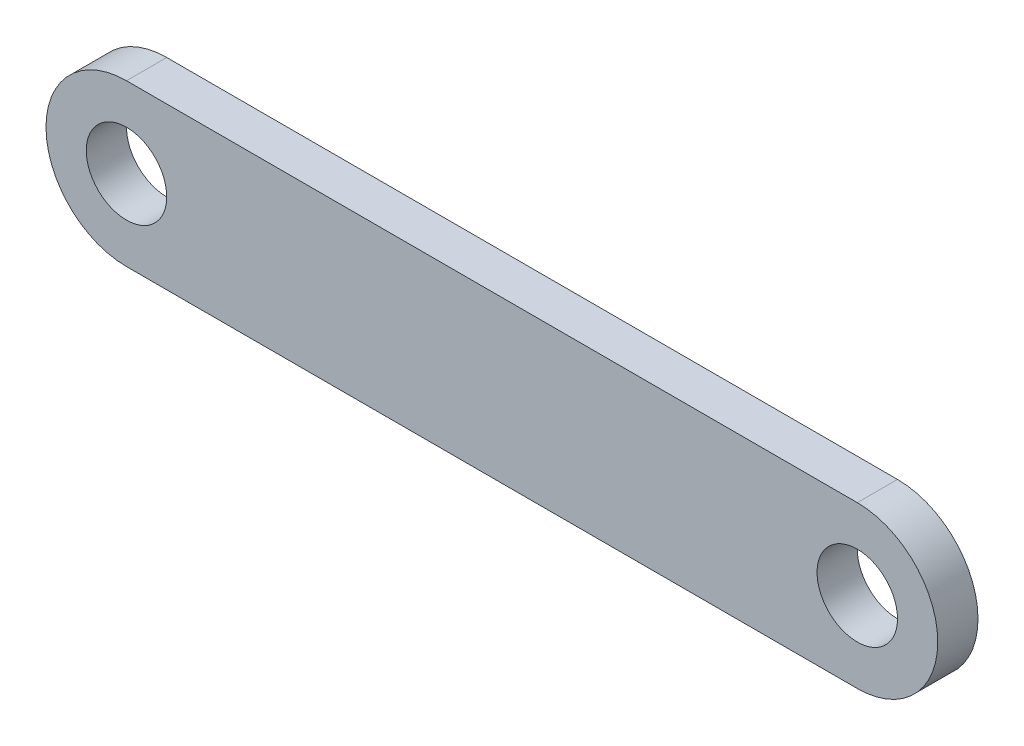
ISO-10303-21;
HEADER;
FILE_DESCRIPTION(('STEP AP214'),'2;1');
FILE_NAME('part.step','',(''),(''),'','','');
FILE_SCHEMA(('AUTOMOTIVE_DESIGN { 1 0 10303 214 1 1 1 1 }'));
ENDSEC;
DATA;
#1=APPLICATION_CONTEXT('core data for automotive mechanical design processes');
#2=APPLICATION_PROTOCOL_DEFINITION('international standard','automotive_design',2000,#1);
#3=PRODUCT_CONTEXT('',#1,'mechanical');
#4=PRODUCT('Part','Part','',(#3));
#5=PRODUCT_RELATED_PRODUCT_CATEGORY('part','',(#4));
#6=PRODUCT_DEFINITION_FORMATION('','',#4);
#7=PRODUCT_DEFINITION_CONTEXT('part definition',#1,'design');
#8=PRODUCT_DEFINITION('design','',#6,#7);
#9=PRODUCT_DEFINITION_SHAPE('','',#8);
#10=(LENGTH_UNIT() NAMED_UNIT(*) SI_UNIT(.MILLI.,.METRE.));
#11=(NAMED_UNIT(*) PLANE_ANGLE_UNIT() SI_UNIT($,.RADIAN.));
#12=(NAMED_UNIT(*) SI_UNIT($,.STERADIAN.) SOLID_ANGLE_UNIT());
#13=UNCERTAINTY_MEASURE_WITH_UNIT(LENGTH_MEASURE(1.E-05),#10,'distance_accuracy_value','');
#14=(GEOMETRIC_REPRESENTATION_CONTEXT(3) GLOBAL_UNCERTAINTY_ASSIGNED_CONTEXT((#13)) GLOBAL_UNIT_ASSIGNED_CONTEXT((#10,
#11,#12)) REPRESENTATION_CONTEXT('',''));
#15=CARTESIAN_POINT('',(0.,0.,0.));
#16=DIRECTION('',(0.,0.,1.));
#17=DIRECTION('',(1.,0.,0.));
#18=AXIS2_PLACEMENT_3D('',#15,#16,#17);
#19=CARTESIAN_POINT('',(0.,-2.,-1.));
#20=DIRECTION('',(0.,-1.,0.));
#21=DIRECTION('',(1.,0.,0.));
#22=AXIS2_PLACEMENT_3D('',#19,#20,#21);
#23=PLANE('',#22);
#24=DIRECTION('',(1.,0.,0.));
#25=VECTOR('',#24,1.);
#26=CARTESIAN_POINT('',(0.,-2.,0.));
#27=LINE('',#26,#25);
#28=CARTESIAN_POINT('',(0.,-2.,0.));
#29=VERTEX_POINT('',#28);
#30=CARTESIAN_POINT('',(18.16,-2.,0.));
#31=VERTEX_POINT('',#30);
#32=EDGE_CURVE('E110',#29,#31,#27,.T.);
#33=ORIENTED_EDGE('',*,*,#32,.F.);
#34=DIRECTION('',(0.,0.,1.));
#35=VECTOR('',#34,1.);
#36=CARTESIAN_POINT('',(0.,-2.,-1.));
#37=LINE('',#36,#35);
#38=CARTESIAN_POINT('',(0.,-2.,-1.));
#39=VERTEX_POINT('',#38);
#40=EDGE_CURVE('E11',#39,#29,#37,.T.);
#41=ORIENTED_EDGE('',*,*,#40,.F.);
#42=DIRECTION('',(1.,0.,0.));
#43=VECTOR('',#42,1.);
#44=CARTESIAN_POINT('',(0.,-2.,-1.));
#45=LINE('',#44,#43);
#46=CARTESIAN_POINT('',(18.16,-2.,-1.));
#47=VERTEX_POINT('',#46);
#48=EDGE_CURVE('E98',#39,#47,#45,.T.);
#49=ORIENTED_EDGE('',*,*,#48,.T.);
#50=DIRECTION('',(0.,0.,1.));
#51=VECTOR('',#50,1.);
#52=CARTESIAN_POINT('',(18.16,-2.,-1.));
#53=LINE('',#52,#51);
#54=EDGE_CURVE('E42',#47,#31,#53,.T.);
#55=ORIENTED_EDGE('',*,*,#54,.T.);
#56=EDGE_LOOP('',(#33,#41,#49,#55));
#57=FACE_BOUND('',#56,.T.);
#58=ADVANCED_FACE('F39',(#57),#23,.T.);
#59=CARTESIAN_POINT('',(0.,0.,-1.));
#60=DIRECTION('',(0.,0.,1.));
#61=DIRECTION('',(1.,0.,0.));
#62=AXIS2_PLACEMENT_3D('',#59,#60,#61);
#63=CYLINDRICAL_SURFACE('',#62,2.);
#64=CARTESIAN_POINT('',(0.,0.,0.));
#65=DIRECTION('',(0.,0.,1.));
#66=DIRECTION('',(1.,0.,0.));
#67=AXIS2_PLACEMENT_3D('',#64,#65,#66);
#68=CIRCLE('',#67,2.);
#69=CARTESIAN_POINT('',(0.,2.,0.));
#70=VERTEX_POINT('',#69);
#71=EDGE_CURVE('E116',#70,#29,#68,.T.);
#72=ORIENTED_EDGE('',*,*,#71,.F.);
#73=DIRECTION('',(0.,0.,1.));
#74=VECTOR('',#73,1.);
#75=CARTESIAN_POINT('',(0.,2.,-1.));
#76=LINE('',#75,#74);
#77=CARTESIAN_POINT('',(0.,2.,-1.));
#78=VERTEX_POINT('',#77);
#79=EDGE_CURVE('E48',#78,#70,#76,.T.);
#80=ORIENTED_EDGE('',*,*,#79,.F.);
#81=CARTESIAN_POINT('',(0.,0.,-1.));
#82=DIRECTION('',(0.,0.,1.));
#83=DIRECTION('',(1.,0.,0.));
#84=AXIS2_PLACEMENT_3D('',#81,#82,#83);
#85=CIRCLE('',#84,2.);
#86=EDGE_CURVE('E91',#78,#39,#85,.T.);
#87=ORIENTED_EDGE('',*,*,#86,.T.);
#88=ORIENTED_EDGE('',*,*,#40,.T.);
#89=EDGE_LOOP('',(#72,#80,#87,#88));
#90=FACE_BOUND('',#89,.T.);
#91=ADVANCED_FACE('F139',(#90),#63,.T.);
#92=CARTESIAN_POINT('',(0.,2.,-1.));
#93=DIRECTION('',(0.,-1.,0.));
#94=DIRECTION('',(1.,0.,0.));
#95=AXIS2_PLACEMENT_3D('',#92,#93,#94);
#96=PLANE('',#95);
#97=DIRECTION('',(1.,0.,0.));
#98=VECTOR('',#97,1.);
#99=CARTESIAN_POINT('',(0.,2.,0.));
#100=LINE('',#99,#98);
#101=CARTESIAN_POINT('',(18.16,2.,0.));
#102=VERTEX_POINT('',#101);
#103=EDGE_CURVE('E95',#70,#102,#100,.T.);
#104=ORIENTED_EDGE('',*,*,#103,.T.);
#105=DIRECTION('',(0.,0.,1.));
#106=VECTOR('',#105,1.);
#107=CARTESIAN_POINT('',(18.16,2.,-1.));
#108=LINE('',#107,#106);
#109=CARTESIAN_POINT('',(18.16,2.,-1.));
#110=VERTEX_POINT('',#109);
#111=EDGE_CURVE('E93',#110,#102,#108,.T.);
#112=ORIENTED_EDGE('',*,*,#111,.F.);
#113=DIRECTION('',(1.,0.,0.));
#114=VECTOR('',#113,1.);
#115=CARTESIAN_POINT('',(0.,2.,-1.));
#116=LINE('',#115,#114);
#117=EDGE_CURVE('E86',#78,#110,#116,.T.);
#118=ORIENTED_EDGE('',*,*,#117,.F.);
#119=ORIENTED_EDGE('',*,*,#79,.T.);
#120=EDGE_LOOP('',(#104,#112,#118,#119));
#121=FACE_BOUND('',#120,.T.);
#122=ADVANCED_FACE('F94',(#121),#96,.F.);
#123=CARTESIAN_POINT('',(0.,0.,-1.));
#124=DIRECTION('',(0.,0.,1.));
#125=DIRECTION('',(1.,0.,0.));
#126=AXIS2_PLACEMENT_3D('',#123,#124,#125);
#127=CYLINDRICAL_SURFACE('',#126,1.);
#128=CARTESIAN_POINT('',(0.,0.,-1.));
#129=DIRECTION('',(0.,0.,1.));
#130=DIRECTION('',(1.,0.,0.));
#131=AXIS2_PLACEMENT_3D('',#128,#129,#130);
#132=CIRCLE('',#131,1.);
#133=CARTESIAN_POINT('',(1.,0.,-1.));
#134=VERTEX_POINT('',#133);
#135=EDGE_CURVE('E104',#134,#134,#132,.T.);
#136=ORIENTED_EDGE('',*,*,#135,.F.);
#137=EDGE_LOOP('',(#136));
#138=FACE_BOUND('',#137,.T.);
#139=CARTESIAN_POINT('',(0.,0.,0.));
#140=DIRECTION('',(0.,0.,1.));
#141=DIRECTION('',(1.,0.,0.));
#142=AXIS2_PLACEMENT_3D('',#139,#140,#141);
#143=CIRCLE('',#142,1.);
#144=CARTESIAN_POINT('',(1.,0.,0.));
#145=VERTEX_POINT('',#144);
#146=EDGE_CURVE('E119',#145,#145,#143,.T.);
#147=ORIENTED_EDGE('',*,*,#146,.T.);
#148=EDGE_LOOP('',(#147));
#149=FACE_BOUND('',#148,.T.);
#150=ADVANCED_FACE('F147',(#138,#149),#127,.F.);
#151=CARTESIAN_POINT('',(18.16,0.,-1.));
#152=DIRECTION('',(0.,0.,1.));
#153=DIRECTION('',(1.,0.,0.));
#154=AXIS2_PLACEMENT_3D('',#151,#152,#153);
#155=CYLINDRICAL_SURFACE('',#154,2.);
#156=CARTESIAN_POINT('',(18.16,0.,0.));
#157=DIRECTION('',(0.,0.,1.));
#158=DIRECTION('',(1.,0.,0.));
#159=AXIS2_PLACEMENT_3D('',#156,#157,#158);
#160=CIRCLE('',#159,2.);
#161=EDGE_CURVE('E113',#31,#102,#160,.T.);
#162=ORIENTED_EDGE('',*,*,#161,.F.);
#163=ORIENTED_EDGE('',*,*,#54,.F.);
#164=CARTESIAN_POINT('',(18.16,0.,-1.));
#165=DIRECTION('',(0.,0.,1.));
#166=DIRECTION('',(1.,0.,0.));
#167=AXIS2_PLACEMENT_3D('',#164,#165,#166);
#168=CIRCLE('',#167,2.);
#169=EDGE_CURVE('E90',#47,#110,#168,.T.);
#170=ORIENTED_EDGE('',*,*,#169,.T.);
#171=ORIENTED_EDGE('',*,*,#111,.T.);
#172=EDGE_LOOP('',(#162,#163,#170,#171));
#173=FACE_BOUND('',#172,.T.);
#174=ADVANCED_FACE('F97',(#173),#155,.T.);
#175=CARTESIAN_POINT('',(18.16,0.,-1.));
#176=DIRECTION('',(0.,0.,1.));
#177=DIRECTION('',(1.,0.,0.));
#178=AXIS2_PLACEMENT_3D('',#175,#176,#177);
#179=CYLINDRICAL_SURFACE('',#178,1.);
#180=CARTESIAN_POINT('',(18.16,0.,-1.));
#181=DIRECTION('',(0.,0.,1.));
#182=DIRECTION('',(1.,0.,0.));
#183=AXIS2_PLACEMENT_3D('',#180,#181,#182);
#184=CIRCLE('',#183,1.);
#185=CARTESIAN_POINT('',(19.16,0.,-1.));
#186=VERTEX_POINT('',#185);
#187=EDGE_CURVE('E107',#186,#186,#184,.T.);
#188=ORIENTED_EDGE('',*,*,#187,.F.);
#189=EDGE_LOOP('',(#188));
#190=FACE_BOUND('',#189,.T.);
#191=CARTESIAN_POINT('',(18.16,0.,0.));
#192=DIRECTION('',(0.,0.,1.));
#193=DIRECTION('',(1.,0.,0.));
#194=AXIS2_PLACEMENT_3D('',#191,#192,#193);
#195=CIRCLE('',#194,1.);
#196=CARTESIAN_POINT('',(19.16,0.,0.));
#197=VERTEX_POINT('',#196);
#198=EDGE_CURVE('E100',#197,#197,#195,.T.);
#199=ORIENTED_EDGE('',*,*,#198,.T.);
#200=EDGE_LOOP('',(#199));
#201=FACE_BOUND('',#200,.T.);
#202=ADVANCED_FACE('F126',(#190,#201),#179,.F.);
#203=CARTESIAN_POINT('',(0.,0.,-1.));
#204=DIRECTION('',(0.,0.,1.));
#205=DIRECTION('',(1.,0.,0.));
#206=AXIS2_PLACEMENT_3D('',#203,#204,#205);
#207=PLANE('',#206);
#208=ORIENTED_EDGE('',*,*,#48,.F.);
#209=ORIENTED_EDGE('',*,*,#86,.F.);
#210=ORIENTED_EDGE('',*,*,#117,.T.);
#211=ORIENTED_EDGE('',*,*,#169,.F.);
#212=EDGE_LOOP('',(#208,#209,#210,#211));
#213=FACE_BOUND('',#212,.T.);
#214=ORIENTED_EDGE('',*,*,#135,.T.);
#215=EDGE_LOOP('',(#214));
#216=FACE_BOUND('',#215,.T.);
#217=ORIENTED_EDGE('',*,*,#187,.T.);
#218=EDGE_LOOP('',(#217));
#219=FACE_BOUND('',#218,.T.);
#220=ADVANCED_FACE('F88',(#213,#216,#219),#207,.F.);
#221=CARTESIAN_POINT('',(0.,0.,0.));
#222=DIRECTION('',(0.,0.,1.));
#223=DIRECTION('',(1.,0.,0.));
#224=AXIS2_PLACEMENT_3D('',#221,#222,#223);
#225=PLANE('',#224);
#226=ORIENTED_EDGE('',*,*,#32,.T.);
#227=ORIENTED_EDGE('',*,*,#161,.T.);
#228=ORIENTED_EDGE('',*,*,#103,.F.);
#229=ORIENTED_EDGE('',*,*,#71,.T.);
#230=EDGE_LOOP('',(#226,#227,#228,#229));
#231=FACE_BOUND('',#230,.T.);
#232=ORIENTED_EDGE('',*,*,#146,.F.);
#233=EDGE_LOOP('',(#232));
#234=FACE_BOUND('',#233,.T.);
#235=ORIENTED_EDGE('',*,*,#198,.F.);
#236=EDGE_LOOP('',(#235));
#237=FACE_BOUND('',#236,.T.);
#238=ADVANCED_FACE('F128',(#231,#234,#237),#225,.T.);
#239=CLOSED_SHELL('',(#58,#91,#122,#150,#174,#202,#220,#238));
#240=MANIFOLD_SOLID_BREP('B2',#239);
#241=ADVANCED_BREP_SHAPE_REPRESENTATION('',(#18,#240),#14);
#242=SHAPE_DEFINITION_REPRESENTATION(#9,#241);
ENDSEC;
END-ISO-10303-21;
